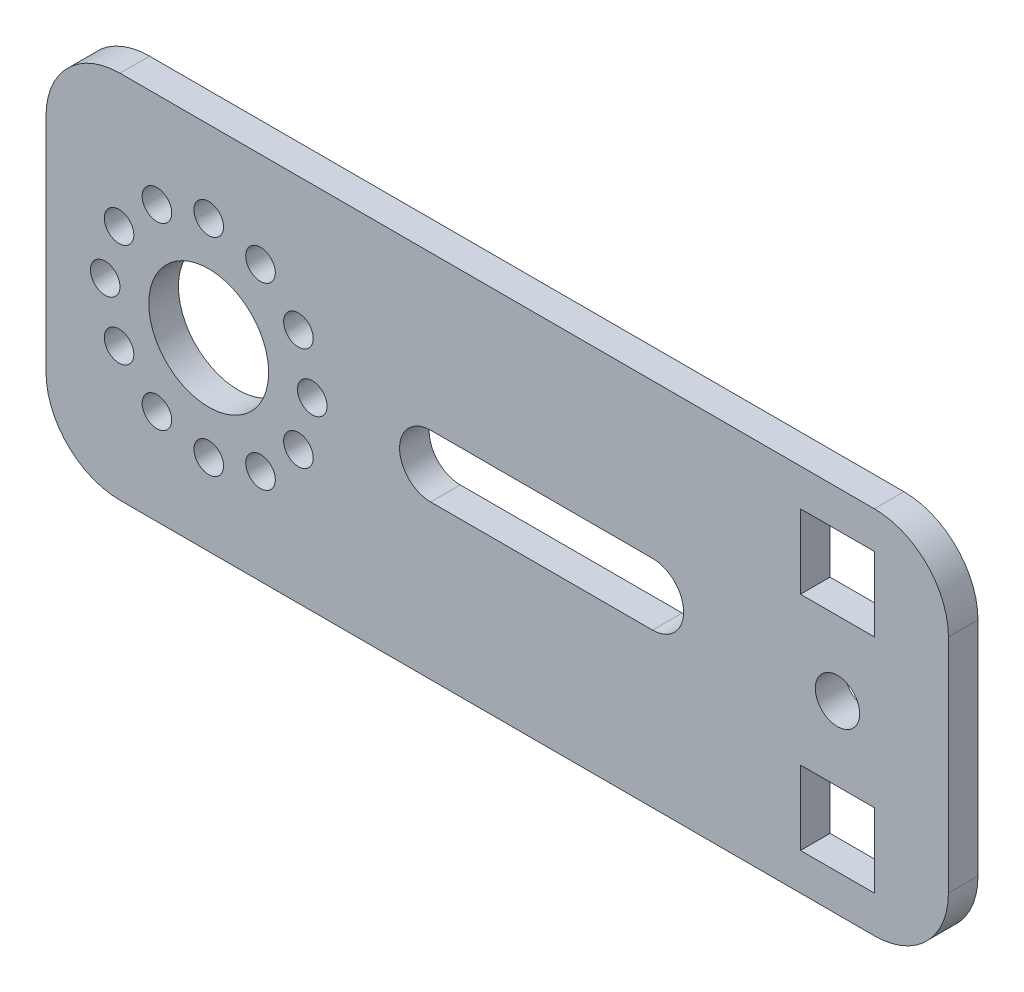
ISO-10303-21;
HEADER;
FILE_DESCRIPTION(('STEP AP214'),'2;1');
FILE_NAME('part.step','',(''),(''),'','','');
FILE_SCHEMA(('AUTOMOTIVE_DESIGN { 1 0 10303 214 1 1 1 1 }'));
ENDSEC;
DATA;
#1=APPLICATION_CONTEXT('core data for automotive mechanical design processes');
#2=APPLICATION_PROTOCOL_DEFINITION('international standard','automotive_design',2000,#1);
#3=PRODUCT_CONTEXT('',#1,'mechanical');
#4=PRODUCT('Part','Part','',(#3));
#5=PRODUCT_RELATED_PRODUCT_CATEGORY('part','',(#4));
#6=PRODUCT_DEFINITION_FORMATION('','',#4);
#7=PRODUCT_DEFINITION_CONTEXT('part definition',#1,'design');
#8=PRODUCT_DEFINITION('design','',#6,#7);
#9=PRODUCT_DEFINITION_SHAPE('','',#8);
#10=(LENGTH_UNIT() NAMED_UNIT(*) SI_UNIT(.MILLI.,.METRE.));
#11=(NAMED_UNIT(*) PLANE_ANGLE_UNIT() SI_UNIT($,.RADIAN.));
#12=(NAMED_UNIT(*) SI_UNIT($,.STERADIAN.) SOLID_ANGLE_UNIT());
#13=UNCERTAINTY_MEASURE_WITH_UNIT(LENGTH_MEASURE(1.E-05),#10,'distance_accuracy_value','');
#14=(GEOMETRIC_REPRESENTATION_CONTEXT(3) GLOBAL_UNCERTAINTY_ASSIGNED_CONTEXT((#13)) GLOBAL_UNIT_ASSIGNED_CONTEXT((#10,
#11,#12)) REPRESENTATION_CONTEXT('',''));
#15=CARTESIAN_POINT('',(0.,0.,0.));
#16=DIRECTION('',(0.,0.,1.));
#17=DIRECTION('',(1.,0.,0.));
#18=AXIS2_PLACEMENT_3D('',#15,#16,#17);
#19=CARTESIAN_POINT('',(61.,12.5,2.));
#20=DIRECTION('',(1.,0.,0.));
#21=DIRECTION('',(0.,0.,-1.));
#22=AXIS2_PLACEMENT_3D('',#19,#20,#21);
#23=PLANE('',#22);
#24=DIRECTION('',(0.,-1.,0.));
#25=VECTOR('',#24,1.);
#26=CARTESIAN_POINT('',(61.,12.5,0.));
#27=LINE('',#26,#25);
#28=CARTESIAN_POINT('',(61.,7.5,0.));
#29=VERTEX_POINT('',#28);
#30=CARTESIAN_POINT('',(61.,-7.5,0.));
#31=VERTEX_POINT('',#30);
#32=EDGE_CURVE('E420',#29,#31,#27,.T.);
#33=ORIENTED_EDGE('',*,*,#32,.F.);
#34=DIRECTION('',(0.,0.,-1.));
#35=VECTOR('',#34,1.);
#36=CARTESIAN_POINT('',(61.,7.5,2.));
#37=LINE('',#36,#35);
#38=CARTESIAN_POINT('',(61.,7.5,2.));
#39=VERTEX_POINT('',#38);
#40=EDGE_CURVE('E483',#29,#39,#37,.F.);
#41=ORIENTED_EDGE('',*,*,#40,.T.);
#42=DIRECTION('',(0.,-1.,0.));
#43=VECTOR('',#42,1.);
#44=CARTESIAN_POINT('',(61.,12.5,2.));
#45=LINE('',#44,#43);
#46=CARTESIAN_POINT('',(61.,-7.5,2.));
#47=VERTEX_POINT('',#46);
#48=EDGE_CURVE('E430',#39,#47,#45,.T.);
#49=ORIENTED_EDGE('',*,*,#48,.T.);
#50=DIRECTION('',(0.,0.,-1.));
#51=VECTOR('',#50,1.);
#52=CARTESIAN_POINT('',(61.,-7.5,2.));
#53=LINE('',#52,#51);
#54=EDGE_CURVE('E479',#47,#31,#53,.T.);
#55=ORIENTED_EDGE('',*,*,#54,.T.);
#56=EDGE_LOOP('',(#33,#41,#49,#55));
#57=FACE_BOUND('',#56,.T.);
#58=ADVANCED_FACE('F39',(#57),#23,.T.);
#59=CARTESIAN_POINT('',(0.,12.5,2.));
#60=DIRECTION('',(0.,1.,0.));
#61=DIRECTION('',(0.,0.,1.));
#62=AXIS2_PLACEMENT_3D('',#59,#60,#61);
#63=PLANE('',#62);
#64=DIRECTION('',(1.,0.,0.));
#65=VECTOR('',#64,1.);
#66=CARTESIAN_POINT('',(0.,12.5,2.));
#67=LINE('',#66,#65);
#68=CARTESIAN_POINT('',(5.,12.5,2.));
#69=VERTEX_POINT('',#68);
#70=CARTESIAN_POINT('',(56.,12.5,2.));
#71=VERTEX_POINT('',#70);
#72=EDGE_CURVE('E442',#69,#71,#67,.T.);
#73=ORIENTED_EDGE('',*,*,#72,.T.);
#74=DIRECTION('',(0.,0.,-1.));
#75=VECTOR('',#74,1.);
#76=CARTESIAN_POINT('',(56.,12.5,2.));
#77=LINE('',#76,#75);
#78=CARTESIAN_POINT('',(56.,12.5,0.));
#79=VERTEX_POINT('',#78);
#80=EDGE_CURVE('E463',#71,#79,#77,.T.);
#81=ORIENTED_EDGE('',*,*,#80,.T.);
#82=DIRECTION('',(1.,0.,0.));
#83=VECTOR('',#82,1.);
#84=CARTESIAN_POINT('',(0.,12.5,0.));
#85=LINE('',#84,#83);
#86=CARTESIAN_POINT('',(5.,12.5,0.));
#87=VERTEX_POINT('',#86);
#88=EDGE_CURVE('E435',#87,#79,#85,.T.);
#89=ORIENTED_EDGE('',*,*,#88,.F.);
#90=DIRECTION('',(0.,0.,-1.));
#91=VECTOR('',#90,1.);
#92=CARTESIAN_POINT('',(5.,12.5,2.));
#93=LINE('',#92,#91);
#94=EDGE_CURVE('E446',#87,#69,#93,.F.);
#95=ORIENTED_EDGE('',*,*,#94,.T.);
#96=EDGE_LOOP('',(#73,#81,#89,#95));
#97=FACE_BOUND('',#96,.T.);
#98=ADVANCED_FACE('F531',(#97),#63,.T.);
#99=CARTESIAN_POINT('',(0.,-12.5,2.));
#100=DIRECTION('',(-1.,0.,0.));
#101=DIRECTION('',(0.,0.,1.));
#102=AXIS2_PLACEMENT_3D('',#99,#100,#101);
#103=PLANE('',#102);
#104=DIRECTION('',(0.,1.,0.));
#105=VECTOR('',#104,1.);
#106=CARTESIAN_POINT('',(0.,-12.5,0.));
#107=LINE('',#106,#105);
#108=CARTESIAN_POINT('',(0.,-7.5,0.));
#109=VERTEX_POINT('',#108);
#110=CARTESIAN_POINT('',(0.,7.5,0.));
#111=VERTEX_POINT('',#110);
#112=EDGE_CURVE('E454',#109,#111,#107,.T.);
#113=ORIENTED_EDGE('',*,*,#112,.F.);
#114=DIRECTION('',(0.,0.,-1.));
#115=VECTOR('',#114,1.);
#116=CARTESIAN_POINT('',(0.,-7.5,2.));
#117=LINE('',#116,#115);
#118=CARTESIAN_POINT('',(0.,-7.5,2.));
#119=VERTEX_POINT('',#118);
#120=EDGE_CURVE('E11',#109,#119,#117,.F.);
#121=ORIENTED_EDGE('',*,*,#120,.T.);
#122=DIRECTION('',(0.,1.,0.));
#123=VECTOR('',#122,1.);
#124=CARTESIAN_POINT('',(0.,-12.5,2.));
#125=LINE('',#124,#123);
#126=CARTESIAN_POINT('',(0.,7.5,2.));
#127=VERTEX_POINT('',#126);
#128=EDGE_CURVE('E438',#119,#127,#125,.T.);
#129=ORIENTED_EDGE('',*,*,#128,.T.);
#130=DIRECTION('',(0.,0.,-1.));
#131=VECTOR('',#130,1.);
#132=CARTESIAN_POINT('',(0.,7.5,2.));
#133=LINE('',#132,#131);
#134=EDGE_CURVE('E48',#127,#111,#133,.T.);
#135=ORIENTED_EDGE('',*,*,#134,.T.);
#136=EDGE_LOOP('',(#113,#121,#129,#135));
#137=FACE_BOUND('',#136,.T.);
#138=ADVANCED_FACE('F507',(#137),#103,.T.);
#139=CARTESIAN_POINT('',(61.,-12.5,2.));
#140=DIRECTION('',(0.,-1.,0.));
#141=DIRECTION('',(0.,0.,-1.));
#142=AXIS2_PLACEMENT_3D('',#139,#140,#141);
#143=PLANE('',#142);
#144=DIRECTION('',(-1.,0.,0.));
#145=VECTOR('',#144,1.);
#146=CARTESIAN_POINT('',(61.,-12.5,0.));
#147=LINE('',#146,#145);
#148=CARTESIAN_POINT('',(56.,-12.5,0.));
#149=VERTEX_POINT('',#148);
#150=CARTESIAN_POINT('',(5.00000000000001,-12.5,0.));
#151=VERTEX_POINT('',#150);
#152=EDGE_CURVE('E450',#149,#151,#147,.T.);
#153=ORIENTED_EDGE('',*,*,#152,.F.);
#154=DIRECTION('',(0.,0.,-1.));
#155=VECTOR('',#154,1.);
#156=CARTESIAN_POINT('',(56.,-12.5,2.));
#157=LINE('',#156,#155);
#158=CARTESIAN_POINT('',(56.,-12.5,2.));
#159=VERTEX_POINT('',#158);
#160=EDGE_CURVE('E62',#149,#159,#157,.F.);
#161=ORIENTED_EDGE('',*,*,#160,.T.);
#162=DIRECTION('',(-1.,0.,0.));
#163=VECTOR('',#162,1.);
#164=CARTESIAN_POINT('',(61.,-12.5,2.));
#165=LINE('',#164,#163);
#166=CARTESIAN_POINT('',(5.00000000000001,-12.5,2.));
#167=VERTEX_POINT('',#166);
#168=EDGE_CURVE('E434',#159,#167,#165,.T.);
#169=ORIENTED_EDGE('',*,*,#168,.T.);
#170=DIRECTION('',(0.,0.,-1.));
#171=VECTOR('',#170,1.);
#172=CARTESIAN_POINT('',(5.,-12.5,2.));
#173=LINE('',#172,#171);
#174=EDGE_CURVE('E497',#167,#151,#173,.T.);
#175=ORIENTED_EDGE('',*,*,#174,.T.);
#176=EDGE_LOOP('',(#153,#161,#169,#175));
#177=FACE_BOUND('',#176,.T.);
#178=ADVANCED_FACE('F517',(#177),#143,.T.);
#179=CARTESIAN_POINT('',(0.,0.,2.));
#180=DIRECTION('',(0.,0.,-1.));
#181=DIRECTION('',(-1.,0.,0.));
#182=AXIS2_PLACEMENT_3D('',#179,#180,#181);
#183=PLANE('',#182);
#184=CARTESIAN_POINT('',(53.5,0.,2.));
#185=DIRECTION('',(0.,0.,-1.));
#186=DIRECTION('',(-1.,0.,0.));
#187=AXIS2_PLACEMENT_3D('',#184,#185,#186);
#188=CIRCLE('',#187,1.5);
#189=CARTESIAN_POINT('',(52.,0.,2.));
#190=VERTEX_POINT('',#189);
#191=EDGE_CURVE('E223',#190,#190,#188,.T.);
#192=ORIENTED_EDGE('',*,*,#191,.T.);
#193=EDGE_LOOP('',(#192));
#194=FACE_BOUND('',#193,.T.);
#195=DIRECTION('',(0.,-1.,0.));
#196=VECTOR('',#195,1.);
#197=CARTESIAN_POINT('',(56.,4.99999999999998,2.));
#198=LINE('',#197,#196);
#199=CARTESIAN_POINT('',(56.,9.99999999999998,2.));
#200=VERTEX_POINT('',#199);
#201=CARTESIAN_POINT('',(56.,4.99999999999998,2.));
#202=VERTEX_POINT('',#201);
#203=EDGE_CURVE('E191',#200,#202,#198,.T.);
#204=ORIENTED_EDGE('',*,*,#203,.T.);
#205=DIRECTION('',(-1.,0.,0.));
#206=VECTOR('',#205,1.);
#207=CARTESIAN_POINT('',(56.,4.99999999999998,2.));
#208=LINE('',#207,#206);
#209=CARTESIAN_POINT('',(51.,4.99999999999998,2.));
#210=VERTEX_POINT('',#209);
#211=EDGE_CURVE('E182',#202,#210,#208,.T.);
#212=ORIENTED_EDGE('',*,*,#211,.T.);
#213=DIRECTION('',(0.,1.,0.));
#214=VECTOR('',#213,1.);
#215=CARTESIAN_POINT('',(51.,4.99999999999998,2.));
#216=LINE('',#215,#214);
#217=CARTESIAN_POINT('',(51.,9.99999999999998,2.));
#218=VERTEX_POINT('',#217);
#219=EDGE_CURVE('E195',#210,#218,#216,.T.);
#220=ORIENTED_EDGE('',*,*,#219,.T.);
#221=DIRECTION('',(1.,0.,0.));
#222=VECTOR('',#221,1.);
#223=CARTESIAN_POINT('',(56.,9.99999999999998,2.));
#224=LINE('',#223,#222);
#225=EDGE_CURVE('E200',#218,#200,#224,.T.);
#226=ORIENTED_EDGE('',*,*,#225,.T.);
#227=EDGE_LOOP('',(#204,#212,#220,#226));
#228=FACE_BOUND('',#227,.T.);
#229=DIRECTION('',(0.,1.,0.));
#230=VECTOR('',#229,1.);
#231=CARTESIAN_POINT('',(51.,-5.00000000000002,2.));
#232=LINE('',#231,#230);
#233=CARTESIAN_POINT('',(51.,-10.,2.));
#234=VERTEX_POINT('',#233);
#235=CARTESIAN_POINT('',(51.,-5.00000000000002,2.));
#236=VERTEX_POINT('',#235);
#237=EDGE_CURVE('E251',#234,#236,#232,.T.);
#238=ORIENTED_EDGE('',*,*,#237,.T.);
#239=DIRECTION('',(1.,0.,0.));
#240=VECTOR('',#239,1.);
#241=CARTESIAN_POINT('',(56.,-5.00000000000002,2.));
#242=LINE('',#241,#240);
#243=CARTESIAN_POINT('',(56.,-5.00000000000002,2.));
#244=VERTEX_POINT('',#243);
#245=EDGE_CURVE('E238',#236,#244,#242,.T.);
#246=ORIENTED_EDGE('',*,*,#245,.T.);
#247=DIRECTION('',(0.,-1.,0.));
#248=VECTOR('',#247,1.);
#249=CARTESIAN_POINT('',(56.,-5.00000000000002,2.));
#250=LINE('',#249,#248);
#251=CARTESIAN_POINT('',(56.,-10.,2.));
#252=VERTEX_POINT('',#251);
#253=EDGE_CURVE('E242',#244,#252,#250,.T.);
#254=ORIENTED_EDGE('',*,*,#253,.T.);
#255=DIRECTION('',(-1.,0.,0.));
#256=VECTOR('',#255,1.);
#257=CARTESIAN_POINT('',(56.,-10.,2.));
#258=LINE('',#257,#256);
#259=EDGE_CURVE('E247',#252,#234,#258,.T.);
#260=ORIENTED_EDGE('',*,*,#259,.T.);
#261=EDGE_LOOP('',(#238,#246,#254,#260));
#262=FACE_BOUND('',#261,.T.);
#263=CARTESIAN_POINT('',(4.93782217350893,3.5,2.));
#264=DIRECTION('',(0.,0.,-1.));
#265=DIRECTION('',(-1.,0.,0.));
#266=AXIS2_PLACEMENT_3D('',#263,#264,#265);
#267=CIRCLE('',#266,1.);
#268=CARTESIAN_POINT('',(3.93782217350893,3.5,2.));
#269=VERTEX_POINT('',#268);
#270=EDGE_CURVE('E282',#269,#269,#267,.T.);
#271=ORIENTED_EDGE('',*,*,#270,.T.);
#272=EDGE_LOOP('',(#271));
#273=FACE_BOUND('',#272,.T.);
#274=CARTESIAN_POINT('',(7.5,6.06217782649107,2.));
#275=DIRECTION('',(0.,0.,-1.));
#276=DIRECTION('',(-1.,0.,0.));
#277=AXIS2_PLACEMENT_3D('',#274,#275,#276);
#278=CIRCLE('',#277,1.);
#279=CARTESIAN_POINT('',(6.5,6.06217782649107,2.));
#280=VERTEX_POINT('',#279);
#281=EDGE_CURVE('E290',#280,#280,#278,.T.);
#282=ORIENTED_EDGE('',*,*,#281,.T.);
#283=EDGE_LOOP('',(#282));
#284=FACE_BOUND('',#283,.T.);
#285=CARTESIAN_POINT('',(11.,7.,2.));
#286=DIRECTION('',(0.,0.,-1.));
#287=DIRECTION('',(-1.,0.,0.));
#288=AXIS2_PLACEMENT_3D('',#285,#286,#287);
#289=CIRCLE('',#288,1.);
#290=CARTESIAN_POINT('',(10.,7.,2.));
#291=VERTEX_POINT('',#290);
#292=EDGE_CURVE('E298',#291,#291,#289,.T.);
#293=ORIENTED_EDGE('',*,*,#292,.T.);
#294=EDGE_LOOP('',(#293));
#295=FACE_BOUND('',#294,.T.);
#296=CARTESIAN_POINT('',(14.5,6.06217782649107,2.));
#297=DIRECTION('',(0.,0.,-1.));
#298=DIRECTION('',(-1.,0.,0.));
#299=AXIS2_PLACEMENT_3D('',#296,#297,#298);
#300=CIRCLE('',#299,1.);
#301=CARTESIAN_POINT('',(13.5,6.06217782649107,2.));
#302=VERTEX_POINT('',#301);
#303=EDGE_CURVE('E306',#302,#302,#300,.T.);
#304=ORIENTED_EDGE('',*,*,#303,.T.);
#305=EDGE_LOOP('',(#304));
#306=FACE_BOUND('',#305,.T.);
#307=CARTESIAN_POINT('',(17.0621778264911,3.5,2.));
#308=DIRECTION('',(0.,0.,-1.));
#309=DIRECTION('',(-1.,0.,0.));
#310=AXIS2_PLACEMENT_3D('',#307,#308,#309);
#311=CIRCLE('',#310,1.);
#312=CARTESIAN_POINT('',(16.0621778264911,3.5,2.));
#313=VERTEX_POINT('',#312);
#314=EDGE_CURVE('E314',#313,#313,#311,.T.);
#315=ORIENTED_EDGE('',*,*,#314,.T.);
#316=EDGE_LOOP('',(#315));
#317=FACE_BOUND('',#316,.T.);
#318=CARTESIAN_POINT('',(18.,0.,2.));
#319=DIRECTION('',(0.,0.,-1.));
#320=DIRECTION('',(-1.,0.,0.));
#321=AXIS2_PLACEMENT_3D('',#318,#319,#320);
#322=CIRCLE('',#321,0.999999999999998);
#323=CARTESIAN_POINT('',(17.,0.,2.));
#324=VERTEX_POINT('',#323);
#325=EDGE_CURVE('E322',#324,#324,#322,.T.);
#326=ORIENTED_EDGE('',*,*,#325,.T.);
#327=EDGE_LOOP('',(#326));
#328=FACE_BOUND('',#327,.T.);
#329=CARTESIAN_POINT('',(17.0621778264911,-3.5,2.));
#330=DIRECTION('',(0.,0.,-1.));
#331=DIRECTION('',(-1.,0.,0.));
#332=AXIS2_PLACEMENT_3D('',#329,#330,#331);
#333=CIRCLE('',#332,0.999999999999998);
#334=CARTESIAN_POINT('',(16.0621778264911,-3.5,2.));
#335=VERTEX_POINT('',#334);
#336=EDGE_CURVE('E330',#335,#335,#333,.T.);
#337=ORIENTED_EDGE('',*,*,#336,.T.);
#338=EDGE_LOOP('',(#337));
#339=FACE_BOUND('',#338,.T.);
#340=CARTESIAN_POINT('',(14.5,-6.06217782649107,2.));
#341=DIRECTION('',(0.,0.,-1.));
#342=DIRECTION('',(-1.,0.,0.));
#343=AXIS2_PLACEMENT_3D('',#340,#341,#342);
#344=CIRCLE('',#343,1.);
#345=CARTESIAN_POINT('',(13.5,-6.06217782649107,2.));
#346=VERTEX_POINT('',#345);
#347=EDGE_CURVE('E338',#346,#346,#344,.T.);
#348=ORIENTED_EDGE('',*,*,#347,.T.);
#349=EDGE_LOOP('',(#348));
#350=FACE_BOUND('',#349,.T.);
#351=CARTESIAN_POINT('',(11.,-7.,2.));
#352=DIRECTION('',(0.,0.,-1.));
#353=DIRECTION('',(-1.,0.,0.));
#354=AXIS2_PLACEMENT_3D('',#351,#352,#353);
#355=CIRCLE('',#354,1.);
#356=CARTESIAN_POINT('',(10.,-7.,2.));
#357=VERTEX_POINT('',#356);
#358=EDGE_CURVE('E346',#357,#357,#355,.T.);
#359=ORIENTED_EDGE('',*,*,#358,.T.);
#360=EDGE_LOOP('',(#359));
#361=FACE_BOUND('',#360,.T.);
#362=CARTESIAN_POINT('',(7.5,-6.06217782649107,2.));
#363=DIRECTION('',(0.,0.,-1.));
#364=DIRECTION('',(-1.,0.,0.));
#365=AXIS2_PLACEMENT_3D('',#362,#363,#364);
#366=CIRCLE('',#365,1.);
#367=CARTESIAN_POINT('',(6.5,-6.06217782649107,2.));
#368=VERTEX_POINT('',#367);
#369=EDGE_CURVE('E354',#368,#368,#366,.T.);
#370=ORIENTED_EDGE('',*,*,#369,.T.);
#371=EDGE_LOOP('',(#370));
#372=FACE_BOUND('',#371,.T.);
#373=CARTESIAN_POINT('',(4.93782217350893,-3.5,2.));
#374=DIRECTION('',(0.,0.,-1.));
#375=DIRECTION('',(-1.,0.,0.));
#376=AXIS2_PLACEMENT_3D('',#373,#374,#375);
#377=CIRCLE('',#376,1.);
#378=CARTESIAN_POINT('',(3.93782217350893,-3.5,2.));
#379=VERTEX_POINT('',#378);
#380=EDGE_CURVE('E362',#379,#379,#377,.T.);
#381=ORIENTED_EDGE('',*,*,#380,.T.);
#382=EDGE_LOOP('',(#381));
#383=FACE_BOUND('',#382,.T.);
#384=CARTESIAN_POINT('',(4.,0.,2.));
#385=DIRECTION('',(0.,0.,-1.));
#386=DIRECTION('',(-1.,0.,0.));
#387=AXIS2_PLACEMENT_3D('',#384,#385,#386);
#388=CIRCLE('',#387,1.);
#389=CARTESIAN_POINT('',(3.,0.,2.));
#390=VERTEX_POINT('',#389);
#391=EDGE_CURVE('E370',#390,#390,#388,.T.);
#392=ORIENTED_EDGE('',*,*,#391,.T.);
#393=EDGE_LOOP('',(#392));
#394=FACE_BOUND('',#393,.T.);
#395=CARTESIAN_POINT('',(11.,0.,2.));
#396=DIRECTION('',(0.,0.,-1.));
#397=DIRECTION('',(-1.,0.,0.));
#398=AXIS2_PLACEMENT_3D('',#395,#396,#397);
#399=CIRCLE('',#398,4.05);
#400=CARTESIAN_POINT('',(6.95,0.,2.));
#401=VERTEX_POINT('',#400);
#402=EDGE_CURVE('E378',#401,#401,#399,.T.);
#403=ORIENTED_EDGE('',*,*,#402,.T.);
#404=EDGE_LOOP('',(#403));
#405=FACE_BOUND('',#404,.T.);
#406=DIRECTION('',(-1.,0.,0.));
#407=VECTOR('',#406,1.);
#408=CARTESIAN_POINT('',(26.,-2.1,2.));
#409=LINE('',#408,#407);
#410=CARTESIAN_POINT('',(41.,-2.1,2.));
#411=VERTEX_POINT('',#410);
#412=CARTESIAN_POINT('',(26.,-2.1,2.));
#413=VERTEX_POINT('',#412);
#414=EDGE_CURVE('E399',#411,#413,#409,.T.);
#415=ORIENTED_EDGE('',*,*,#414,.T.);
#416=CARTESIAN_POINT('',(26.,0.,2.));
#417=DIRECTION('',(0.,0.,-1.));
#418=DIRECTION('',(-1.,0.,0.));
#419=AXIS2_PLACEMENT_3D('',#416,#417,#418);
#420=CIRCLE('',#419,2.1);
#421=CARTESIAN_POINT('',(26.,2.1,2.));
#422=VERTEX_POINT('',#421);
#423=EDGE_CURVE('E386',#413,#422,#420,.T.);
#424=ORIENTED_EDGE('',*,*,#423,.T.);
#425=DIRECTION('',(1.,0.,0.));
#426=VECTOR('',#425,1.);
#427=CARTESIAN_POINT('',(26.,2.1,2.));
#428=LINE('',#427,#426);
#429=CARTESIAN_POINT('',(41.,2.1,2.));
#430=VERTEX_POINT('',#429);
#431=EDGE_CURVE('E390',#422,#430,#428,.T.);
#432=ORIENTED_EDGE('',*,*,#431,.T.);
#433=CARTESIAN_POINT('',(41.,0.,2.));
#434=DIRECTION('',(0.,0.,-1.));
#435=DIRECTION('',(-1.,0.,0.));
#436=AXIS2_PLACEMENT_3D('',#433,#434,#435);
#437=CIRCLE('',#436,2.1);
#438=EDGE_CURVE('E395',#430,#411,#437,.T.);
#439=ORIENTED_EDGE('',*,*,#438,.T.);
#440=EDGE_LOOP('',(#415,#424,#432,#439));
#441=FACE_BOUND('',#440,.T.);
#442=ORIENTED_EDGE('',*,*,#48,.F.);
#443=CARTESIAN_POINT('',(56.,7.5,2.));
#444=DIRECTION('',(0.,0.,-1.));
#445=DIRECTION('',(-1.,0.,0.));
#446=AXIS2_PLACEMENT_3D('',#443,#444,#445);
#447=CIRCLE('',#446,5.);
#448=EDGE_CURVE('E494',#39,#71,#447,.F.);
#449=ORIENTED_EDGE('',*,*,#448,.T.);
#450=ORIENTED_EDGE('',*,*,#72,.F.);
#451=CARTESIAN_POINT('',(5.,7.5,2.));
#452=DIRECTION('',(0.,0.,-1.));
#453=DIRECTION('',(-1.,0.,0.));
#454=AXIS2_PLACEMENT_3D('',#451,#452,#453);
#455=CIRCLE('',#454,5.);
#456=EDGE_CURVE('E486',#69,#127,#455,.F.);
#457=ORIENTED_EDGE('',*,*,#456,.T.);
#458=ORIENTED_EDGE('',*,*,#128,.F.);
#459=CARTESIAN_POINT('',(5.,-7.5,2.));
#460=DIRECTION('',(0.,0.,-1.));
#461=DIRECTION('',(-1.,0.,0.));
#462=AXIS2_PLACEMENT_3D('',#459,#460,#461);
#463=CIRCLE('',#462,5.);
#464=EDGE_CURVE('E55',#119,#167,#463,.F.);
#465=ORIENTED_EDGE('',*,*,#464,.T.);
#466=ORIENTED_EDGE('',*,*,#168,.F.);
#467=CARTESIAN_POINT('',(56.,-7.5,2.));
#468=DIRECTION('',(0.,0.,-1.));
#469=DIRECTION('',(-1.,0.,0.));
#470=AXIS2_PLACEMENT_3D('',#467,#468,#469);
#471=CIRCLE('',#470,5.);
#472=EDGE_CURVE('E491',#159,#47,#471,.F.);
#473=ORIENTED_EDGE('',*,*,#472,.T.);
#474=EDGE_LOOP('',(#442,#449,#450,#457,#458,#465,#466,#473));
#475=FACE_BOUND('',#474,.T.);
#476=ADVANCED_FACE('F202',(#194,#228,#262,#273,#284,#295,#306,#317,#328,#339,#350,#361,#372,
#383,#394,#405,#441,#475),#183,.F.);
#477=CARTESIAN_POINT('',(0.,0.,0.));
#478=DIRECTION('',(0.,0.,-1.));
#479=DIRECTION('',(-1.,0.,0.));
#480=AXIS2_PLACEMENT_3D('',#477,#478,#479);
#481=PLANE('',#480);
#482=CARTESIAN_POINT('',(53.5,0.,0.));
#483=DIRECTION('',(0.,0.,-1.));
#484=DIRECTION('',(-1.,0.,0.));
#485=AXIS2_PLACEMENT_3D('',#482,#483,#484);
#486=CIRCLE('',#485,1.5);
#487=CARTESIAN_POINT('',(52.,0.,0.));
#488=VERTEX_POINT('',#487);
#489=EDGE_CURVE('E213',#488,#488,#486,.T.);
#490=ORIENTED_EDGE('',*,*,#489,.F.);
#491=EDGE_LOOP('',(#490));
#492=FACE_BOUND('',#491,.T.);
#493=DIRECTION('',(-1.,0.,0.));
#494=VECTOR('',#493,1.);
#495=CARTESIAN_POINT('',(56.,4.99999999999998,0.));
#496=LINE('',#495,#494);
#497=CARTESIAN_POINT('',(56.,4.99999999999998,0.));
#498=VERTEX_POINT('',#497);
#499=CARTESIAN_POINT('',(51.,4.99999999999998,0.));
#500=VERTEX_POINT('',#499);
#501=EDGE_CURVE('E185',#498,#500,#496,.T.);
#502=ORIENTED_EDGE('',*,*,#501,.F.);
#503=DIRECTION('',(0.,-1.,0.));
#504=VECTOR('',#503,1.);
#505=CARTESIAN_POINT('',(56.,4.99999999999998,0.));
#506=LINE('',#505,#504);
#507=CARTESIAN_POINT('',(56.,9.99999999999998,0.));
#508=VERTEX_POINT('',#507);
#509=EDGE_CURVE('E206',#508,#498,#506,.T.);
#510=ORIENTED_EDGE('',*,*,#509,.F.);
#511=DIRECTION('',(1.,0.,0.));
#512=VECTOR('',#511,1.);
#513=CARTESIAN_POINT('',(56.,9.99999999999998,0.));
#514=LINE('',#513,#512);
#515=CARTESIAN_POINT('',(51.,9.99999999999998,0.));
#516=VERTEX_POINT('',#515);
#517=EDGE_CURVE('E210',#516,#508,#514,.T.);
#518=ORIENTED_EDGE('',*,*,#517,.F.);
#519=DIRECTION('',(0.,1.,0.));
#520=VECTOR('',#519,1.);
#521=CARTESIAN_POINT('',(51.,4.99999999999998,0.));
#522=LINE('',#521,#520);
#523=EDGE_CURVE('E222',#500,#516,#522,.T.);
#524=ORIENTED_EDGE('',*,*,#523,.F.);
#525=EDGE_LOOP('',(#502,#510,#518,#524));
#526=FACE_BOUND('',#525,.T.);
#527=DIRECTION('',(1.,0.,0.));
#528=VECTOR('',#527,1.);
#529=CARTESIAN_POINT('',(56.,-5.00000000000002,0.));
#530=LINE('',#529,#528);
#531=CARTESIAN_POINT('',(51.,-5.00000000000002,0.));
#532=VERTEX_POINT('',#531);
#533=CARTESIAN_POINT('',(56.,-5.00000000000002,0.));
#534=VERTEX_POINT('',#533);
#535=EDGE_CURVE('E232',#532,#534,#530,.T.);
#536=ORIENTED_EDGE('',*,*,#535,.F.);
#537=DIRECTION('',(0.,1.,0.));
#538=VECTOR('',#537,1.);
#539=CARTESIAN_POINT('',(51.,-5.00000000000002,0.));
#540=LINE('',#539,#538);
#541=CARTESIAN_POINT('',(51.,-10.,0.));
#542=VERTEX_POINT('',#541);
#543=EDGE_CURVE('E243',#542,#532,#540,.T.);
#544=ORIENTED_EDGE('',*,*,#543,.F.);
#545=DIRECTION('',(-1.,0.,0.));
#546=VECTOR('',#545,1.);
#547=CARTESIAN_POINT('',(56.,-10.,0.));
#548=LINE('',#547,#546);
#549=CARTESIAN_POINT('',(56.,-10.,0.));
#550=VERTEX_POINT('',#549);
#551=EDGE_CURVE('E262',#550,#542,#548,.T.);
#552=ORIENTED_EDGE('',*,*,#551,.F.);
#553=DIRECTION('',(0.,-1.,0.));
#554=VECTOR('',#553,1.);
#555=CARTESIAN_POINT('',(56.,-5.00000000000002,0.));
#556=LINE('',#555,#554);
#557=EDGE_CURVE('E258',#534,#550,#556,.T.);
#558=ORIENTED_EDGE('',*,*,#557,.F.);
#559=EDGE_LOOP('',(#536,#544,#552,#558));
#560=FACE_BOUND('',#559,.T.);
#561=CARTESIAN_POINT('',(4.93782217350893,3.5,0.));
#562=DIRECTION('',(0.,0.,-1.));
#563=DIRECTION('',(-1.,0.,0.));
#564=AXIS2_PLACEMENT_3D('',#561,#562,#563);
#565=CIRCLE('',#564,1.);
#566=CARTESIAN_POINT('',(3.93782217350893,3.5,0.));
#567=VERTEX_POINT('',#566);
#568=EDGE_CURVE('E272',#567,#567,#565,.T.);
#569=ORIENTED_EDGE('',*,*,#568,.F.);
#570=EDGE_LOOP('',(#569));
#571=FACE_BOUND('',#570,.T.);
#572=CARTESIAN_POINT('',(7.5,6.06217782649107,0.));
#573=DIRECTION('',(0.,0.,-1.));
#574=DIRECTION('',(-1.,0.,0.));
#575=AXIS2_PLACEMENT_3D('',#572,#573,#574);
#576=CIRCLE('',#575,1.);
#577=CARTESIAN_POINT('',(6.5,6.06217782649107,0.));
#578=VERTEX_POINT('',#577);
#579=EDGE_CURVE('E286',#578,#578,#576,.T.);
#580=ORIENTED_EDGE('',*,*,#579,.F.);
#581=EDGE_LOOP('',(#580));
#582=FACE_BOUND('',#581,.T.);
#583=CARTESIAN_POINT('',(11.,7.,0.));
#584=DIRECTION('',(0.,0.,-1.));
#585=DIRECTION('',(-1.,0.,0.));
#586=AXIS2_PLACEMENT_3D('',#583,#584,#585);
#587=CIRCLE('',#586,1.);
#588=CARTESIAN_POINT('',(10.,7.,0.));
#589=VERTEX_POINT('',#588);
#590=EDGE_CURVE('E294',#589,#589,#587,.T.);
#591=ORIENTED_EDGE('',*,*,#590,.F.);
#592=EDGE_LOOP('',(#591));
#593=FACE_BOUND('',#592,.T.);
#594=CARTESIAN_POINT('',(14.5,6.06217782649107,0.));
#595=DIRECTION('',(0.,0.,-1.));
#596=DIRECTION('',(-1.,0.,0.));
#597=AXIS2_PLACEMENT_3D('',#594,#595,#596);
#598=CIRCLE('',#597,1.);
#599=CARTESIAN_POINT('',(13.5,6.06217782649107,0.));
#600=VERTEX_POINT('',#599);
#601=EDGE_CURVE('E302',#600,#600,#598,.T.);
#602=ORIENTED_EDGE('',*,*,#601,.F.);
#603=EDGE_LOOP('',(#602));
#604=FACE_BOUND('',#603,.T.);
#605=CARTESIAN_POINT('',(17.0621778264911,3.5,0.));
#606=DIRECTION('',(0.,0.,-1.));
#607=DIRECTION('',(-1.,0.,0.));
#608=AXIS2_PLACEMENT_3D('',#605,#606,#607);
#609=CIRCLE('',#608,1.);
#610=CARTESIAN_POINT('',(16.0621778264911,3.5,0.));
#611=VERTEX_POINT('',#610);
#612=EDGE_CURVE('E310',#611,#611,#609,.T.);
#613=ORIENTED_EDGE('',*,*,#612,.F.);
#614=EDGE_LOOP('',(#613));
#615=FACE_BOUND('',#614,.T.);
#616=CARTESIAN_POINT('',(18.,0.,0.));
#617=DIRECTION('',(0.,0.,-1.));
#618=DIRECTION('',(-1.,0.,0.));
#619=AXIS2_PLACEMENT_3D('',#616,#617,#618);
#620=CIRCLE('',#619,0.999999999999998);
#621=CARTESIAN_POINT('',(17.,0.,0.));
#622=VERTEX_POINT('',#621);
#623=EDGE_CURVE('E318',#622,#622,#620,.T.);
#624=ORIENTED_EDGE('',*,*,#623,.F.);
#625=EDGE_LOOP('',(#624));
#626=FACE_BOUND('',#625,.T.);
#627=CARTESIAN_POINT('',(17.0621778264911,-3.5,0.));
#628=DIRECTION('',(0.,0.,-1.));
#629=DIRECTION('',(-1.,0.,0.));
#630=AXIS2_PLACEMENT_3D('',#627,#628,#629);
#631=CIRCLE('',#630,0.999999999999998);
#632=CARTESIAN_POINT('',(16.0621778264911,-3.5,0.));
#633=VERTEX_POINT('',#632);
#634=EDGE_CURVE('E326',#633,#633,#631,.T.);
#635=ORIENTED_EDGE('',*,*,#634,.F.);
#636=EDGE_LOOP('',(#635));
#637=FACE_BOUND('',#636,.T.);
#638=CARTESIAN_POINT('',(14.5,-6.06217782649107,0.));
#639=DIRECTION('',(0.,0.,-1.));
#640=DIRECTION('',(-1.,0.,0.));
#641=AXIS2_PLACEMENT_3D('',#638,#639,#640);
#642=CIRCLE('',#641,1.);
#643=CARTESIAN_POINT('',(13.5,-6.06217782649107,0.));
#644=VERTEX_POINT('',#643);
#645=EDGE_CURVE('E334',#644,#644,#642,.T.);
#646=ORIENTED_EDGE('',*,*,#645,.F.);
#647=EDGE_LOOP('',(#646));
#648=FACE_BOUND('',#647,.T.);
#649=CARTESIAN_POINT('',(11.,-7.,0.));
#650=DIRECTION('',(0.,0.,-1.));
#651=DIRECTION('',(-1.,0.,0.));
#652=AXIS2_PLACEMENT_3D('',#649,#650,#651);
#653=CIRCLE('',#652,1.);
#654=CARTESIAN_POINT('',(10.,-7.,0.));
#655=VERTEX_POINT('',#654);
#656=EDGE_CURVE('E342',#655,#655,#653,.T.);
#657=ORIENTED_EDGE('',*,*,#656,.F.);
#658=EDGE_LOOP('',(#657));
#659=FACE_BOUND('',#658,.T.);
#660=CARTESIAN_POINT('',(7.5,-6.06217782649107,0.));
#661=DIRECTION('',(0.,0.,-1.));
#662=DIRECTION('',(-1.,0.,0.));
#663=AXIS2_PLACEMENT_3D('',#660,#661,#662);
#664=CIRCLE('',#663,1.);
#665=CARTESIAN_POINT('',(6.5,-6.06217782649107,0.));
#666=VERTEX_POINT('',#665);
#667=EDGE_CURVE('E350',#666,#666,#664,.T.);
#668=ORIENTED_EDGE('',*,*,#667,.F.);
#669=EDGE_LOOP('',(#668));
#670=FACE_BOUND('',#669,.T.);
#671=CARTESIAN_POINT('',(4.93782217350893,-3.5,0.));
#672=DIRECTION('',(0.,0.,-1.));
#673=DIRECTION('',(-1.,0.,0.));
#674=AXIS2_PLACEMENT_3D('',#671,#672,#673);
#675=CIRCLE('',#674,1.);
#676=CARTESIAN_POINT('',(3.93782217350893,-3.5,0.));
#677=VERTEX_POINT('',#676);
#678=EDGE_CURVE('E358',#677,#677,#675,.T.);
#679=ORIENTED_EDGE('',*,*,#678,.F.);
#680=EDGE_LOOP('',(#679));
#681=FACE_BOUND('',#680,.T.);
#682=CARTESIAN_POINT('',(4.,0.,0.));
#683=DIRECTION('',(0.,0.,-1.));
#684=DIRECTION('',(-1.,0.,0.));
#685=AXIS2_PLACEMENT_3D('',#682,#683,#684);
#686=CIRCLE('',#685,1.);
#687=CARTESIAN_POINT('',(3.,0.,0.));
#688=VERTEX_POINT('',#687);
#689=EDGE_CURVE('E366',#688,#688,#686,.T.);
#690=ORIENTED_EDGE('',*,*,#689,.F.);
#691=EDGE_LOOP('',(#690));
#692=FACE_BOUND('',#691,.T.);
#693=CARTESIAN_POINT('',(11.,0.,0.));
#694=DIRECTION('',(0.,0.,-1.));
#695=DIRECTION('',(-1.,0.,0.));
#696=AXIS2_PLACEMENT_3D('',#693,#694,#695);
#697=CIRCLE('',#696,4.05);
#698=CARTESIAN_POINT('',(6.95,0.,0.));
#699=VERTEX_POINT('',#698);
#700=EDGE_CURVE('E374',#699,#699,#697,.T.);
#701=ORIENTED_EDGE('',*,*,#700,.F.);
#702=EDGE_LOOP('',(#701));
#703=FACE_BOUND('',#702,.T.);
#704=CARTESIAN_POINT('',(26.,0.,0.));
#705=DIRECTION('',(0.,0.,-1.));
#706=DIRECTION('',(-1.,0.,0.));
#707=AXIS2_PLACEMENT_3D('',#704,#705,#706);
#708=CIRCLE('',#707,2.1);
#709=CARTESIAN_POINT('',(26.,-2.1,0.));
#710=VERTEX_POINT('',#709);
#711=CARTESIAN_POINT('',(26.,2.1,0.));
#712=VERTEX_POINT('',#711);
#713=EDGE_CURVE('E382',#710,#712,#708,.T.);
#714=ORIENTED_EDGE('',*,*,#713,.F.);
#715=DIRECTION('',(-1.,0.,0.));
#716=VECTOR('',#715,1.);
#717=CARTESIAN_POINT('',(26.,-2.1,0.));
#718=LINE('',#717,#716);
#719=CARTESIAN_POINT('',(41.,-2.1,0.));
#720=VERTEX_POINT('',#719);
#721=EDGE_CURVE('E391',#720,#710,#718,.T.);
#722=ORIENTED_EDGE('',*,*,#721,.F.);
#723=CARTESIAN_POINT('',(41.,0.,0.));
#724=DIRECTION('',(0.,0.,-1.));
#725=DIRECTION('',(-1.,0.,0.));
#726=AXIS2_PLACEMENT_3D('',#723,#724,#725);
#727=CIRCLE('',#726,2.1);
#728=CARTESIAN_POINT('',(41.,2.1,0.));
#729=VERTEX_POINT('',#728);
#730=EDGE_CURVE('E410',#729,#720,#727,.T.);
#731=ORIENTED_EDGE('',*,*,#730,.F.);
#732=DIRECTION('',(1.,0.,0.));
#733=VECTOR('',#732,1.);
#734=CARTESIAN_POINT('',(26.,2.1,0.));
#735=LINE('',#734,#733);
#736=EDGE_CURVE('E406',#712,#729,#735,.T.);
#737=ORIENTED_EDGE('',*,*,#736,.F.);
#738=EDGE_LOOP('',(#714,#722,#731,#737));
#739=FACE_BOUND('',#738,.T.);
#740=ORIENTED_EDGE('',*,*,#88,.T.);
#741=CARTESIAN_POINT('',(56.,7.5,0.));
#742=DIRECTION('',(0.,0.,-1.));
#743=DIRECTION('',(-1.,0.,0.));
#744=AXIS2_PLACEMENT_3D('',#741,#742,#743);
#745=CIRCLE('',#744,5.);
#746=EDGE_CURVE('E476',#79,#29,#745,.T.);
#747=ORIENTED_EDGE('',*,*,#746,.T.);
#748=ORIENTED_EDGE('',*,*,#32,.T.);
#749=CARTESIAN_POINT('',(56.,-7.5,0.));
#750=DIRECTION('',(0.,0.,-1.));
#751=DIRECTION('',(-1.,0.,0.));
#752=AXIS2_PLACEMENT_3D('',#749,#750,#751);
#753=CIRCLE('',#752,5.);
#754=EDGE_CURVE('E473',#31,#149,#753,.T.);
#755=ORIENTED_EDGE('',*,*,#754,.T.);
#756=ORIENTED_EDGE('',*,*,#152,.T.);
#757=CARTESIAN_POINT('',(5.,-7.5,0.));
#758=DIRECTION('',(0.,0.,-1.));
#759=DIRECTION('',(-1.,0.,0.));
#760=AXIS2_PLACEMENT_3D('',#757,#758,#759);
#761=CIRCLE('',#760,5.);
#762=EDGE_CURVE('E470',#151,#109,#761,.T.);
#763=ORIENTED_EDGE('',*,*,#762,.T.);
#764=ORIENTED_EDGE('',*,*,#112,.T.);
#765=CARTESIAN_POINT('',(5.,7.5,0.));
#766=DIRECTION('',(0.,0.,-1.));
#767=DIRECTION('',(-1.,0.,0.));
#768=AXIS2_PLACEMENT_3D('',#765,#766,#767);
#769=CIRCLE('',#768,5.);
#770=EDGE_CURVE('E467',#111,#87,#769,.T.);
#771=ORIENTED_EDGE('',*,*,#770,.T.);
#772=EDGE_LOOP('',(#740,#747,#748,#755,#756,#763,#764,#771));
#773=FACE_BOUND('',#772,.T.);
#774=ADVANCED_FACE('F512',(#492,#526,#560,#571,#582,#593,#604,#615,#626,#637,#648,#659,#670,
#681,#692,#703,#739,#773),#481,.T.);
#775=CARTESIAN_POINT('',(26.,0.,2.));
#776=DIRECTION('',(0.,0.,-1.));
#777=DIRECTION('',(-1.,0.,0.));
#778=AXIS2_PLACEMENT_3D('',#775,#776,#777);
#779=CYLINDRICAL_SURFACE('',#778,2.1);
#780=ORIENTED_EDGE('',*,*,#713,.T.);
#781=DIRECTION('',(0.,0.,-1.));
#782=VECTOR('',#781,1.);
#783=CARTESIAN_POINT('',(26.,2.1,2.));
#784=LINE('',#783,#782);
#785=EDGE_CURVE('E403',#422,#712,#784,.T.);
#786=ORIENTED_EDGE('',*,*,#785,.F.);
#787=ORIENTED_EDGE('',*,*,#423,.F.);
#788=DIRECTION('',(0.,0.,-1.));
#789=VECTOR('',#788,1.);
#790=CARTESIAN_POINT('',(26.,-2.1,2.));
#791=LINE('',#790,#789);
#792=EDGE_CURVE('E417',#413,#710,#791,.T.);
#793=ORIENTED_EDGE('',*,*,#792,.T.);
#794=EDGE_LOOP('',(#780,#786,#787,#793));
#795=FACE_BOUND('',#794,.T.);
#796=ADVANCED_FACE('F792',(#795),#779,.F.);
#797=CARTESIAN_POINT('',(26.,-2.1,2.));
#798=DIRECTION('',(0.,-1.,0.));
#799=DIRECTION('',(1.,0.,0.));
#800=AXIS2_PLACEMENT_3D('',#797,#798,#799);
#801=PLANE('',#800);
#802=ORIENTED_EDGE('',*,*,#721,.T.);
#803=ORIENTED_EDGE('',*,*,#792,.F.);
#804=ORIENTED_EDGE('',*,*,#414,.F.);
#805=DIRECTION('',(0.,0.,-1.));
#806=VECTOR('',#805,1.);
#807=CARTESIAN_POINT('',(41.,-2.1,2.));
#808=LINE('',#807,#806);
#809=EDGE_CURVE('E421',#411,#720,#808,.T.);
#810=ORIENTED_EDGE('',*,*,#809,.T.);
#811=EDGE_LOOP('',(#802,#803,#804,#810));
#812=FACE_BOUND('',#811,.T.);
#813=ADVANCED_FACE('F783',(#812),#801,.F.);
#814=CARTESIAN_POINT('',(41.,0.,2.));
#815=DIRECTION('',(0.,0.,-1.));
#816=DIRECTION('',(-1.,0.,0.));
#817=AXIS2_PLACEMENT_3D('',#814,#815,#816);
#818=CYLINDRICAL_SURFACE('',#817,2.1);
#819=ORIENTED_EDGE('',*,*,#730,.T.);
#820=ORIENTED_EDGE('',*,*,#809,.F.);
#821=ORIENTED_EDGE('',*,*,#438,.F.);
#822=DIRECTION('',(0.,0.,-1.));
#823=VECTOR('',#822,1.);
#824=CARTESIAN_POINT('',(41.,2.1,2.));
#825=LINE('',#824,#823);
#826=EDGE_CURVE('E424',#430,#729,#825,.T.);
#827=ORIENTED_EDGE('',*,*,#826,.T.);
#828=EDGE_LOOP('',(#819,#820,#821,#827));
#829=FACE_BOUND('',#828,.T.);
#830=ADVANCED_FACE('F774',(#829),#818,.F.);
#831=CARTESIAN_POINT('',(26.,2.1,2.));
#832=DIRECTION('',(0.,1.,0.));
#833=DIRECTION('',(-1.,0.,0.));
#834=AXIS2_PLACEMENT_3D('',#831,#832,#833);
#835=PLANE('',#834);
#836=ORIENTED_EDGE('',*,*,#736,.T.);
#837=ORIENTED_EDGE('',*,*,#826,.F.);
#838=ORIENTED_EDGE('',*,*,#431,.F.);
#839=ORIENTED_EDGE('',*,*,#785,.T.);
#840=EDGE_LOOP('',(#836,#837,#838,#839));
#841=FACE_BOUND('',#840,.T.);
#842=ADVANCED_FACE('F765',(#841),#835,.F.);
#843=CARTESIAN_POINT('',(11.,0.,2.));
#844=DIRECTION('',(0.,0.,-1.));
#845=DIRECTION('',(-1.,0.,0.));
#846=AXIS2_PLACEMENT_3D('',#843,#844,#845);
#847=CYLINDRICAL_SURFACE('',#846,4.05);
#848=ORIENTED_EDGE('',*,*,#402,.F.);
#849=EDGE_LOOP('',(#848));
#850=FACE_BOUND('',#849,.T.);
#851=ORIENTED_EDGE('',*,*,#700,.T.);
#852=EDGE_LOOP('',(#851));
#853=FACE_BOUND('',#852,.T.);
#854=ADVANCED_FACE('F756',(#850,#853),#847,.F.);
#855=CARTESIAN_POINT('',(4.,0.,2.));
#856=DIRECTION('',(0.,0.,-1.));
#857=DIRECTION('',(-1.,0.,0.));
#858=AXIS2_PLACEMENT_3D('',#855,#856,#857);
#859=CYLINDRICAL_SURFACE('',#858,1.);
#860=ORIENTED_EDGE('',*,*,#391,.F.);
#861=EDGE_LOOP('',(#860));
#862=FACE_BOUND('',#861,.T.);
#863=ORIENTED_EDGE('',*,*,#689,.T.);
#864=EDGE_LOOP('',(#863));
#865=FACE_BOUND('',#864,.T.);
#866=ADVANCED_FACE('F747',(#862,#865),#859,.F.);
#867=CARTESIAN_POINT('',(4.93782217350893,-3.5,2.));
#868=DIRECTION('',(0.,0.,-1.));
#869=DIRECTION('',(-1.,0.,0.));
#870=AXIS2_PLACEMENT_3D('',#867,#868,#869);
#871=CYLINDRICAL_SURFACE('',#870,1.);
#872=ORIENTED_EDGE('',*,*,#380,.F.);
#873=EDGE_LOOP('',(#872));
#874=FACE_BOUND('',#873,.T.);
#875=ORIENTED_EDGE('',*,*,#678,.T.);
#876=EDGE_LOOP('',(#875));
#877=FACE_BOUND('',#876,.T.);
#878=ADVANCED_FACE('F738',(#874,#877),#871,.F.);
#879=CARTESIAN_POINT('',(7.5,-6.06217782649107,2.));
#880=DIRECTION('',(0.,0.,-1.));
#881=DIRECTION('',(-1.,0.,0.));
#882=AXIS2_PLACEMENT_3D('',#879,#880,#881);
#883=CYLINDRICAL_SURFACE('',#882,1.);
#884=ORIENTED_EDGE('',*,*,#369,.F.);
#885=EDGE_LOOP('',(#884));
#886=FACE_BOUND('',#885,.T.);
#887=ORIENTED_EDGE('',*,*,#667,.T.);
#888=EDGE_LOOP('',(#887));
#889=FACE_BOUND('',#888,.T.);
#890=ADVANCED_FACE('F729',(#886,#889),#883,.F.);
#891=CARTESIAN_POINT('',(11.,-7.,2.));
#892=DIRECTION('',(0.,0.,-1.));
#893=DIRECTION('',(-1.,0.,0.));
#894=AXIS2_PLACEMENT_3D('',#891,#892,#893);
#895=CYLINDRICAL_SURFACE('',#894,1.);
#896=ORIENTED_EDGE('',*,*,#358,.F.);
#897=EDGE_LOOP('',(#896));
#898=FACE_BOUND('',#897,.T.);
#899=ORIENTED_EDGE('',*,*,#656,.T.);
#900=EDGE_LOOP('',(#899));
#901=FACE_BOUND('',#900,.T.);
#902=ADVANCED_FACE('F720',(#898,#901),#895,.F.);
#903=CARTESIAN_POINT('',(14.5,-6.06217782649107,2.));
#904=DIRECTION('',(0.,0.,-1.));
#905=DIRECTION('',(-1.,0.,0.));
#906=AXIS2_PLACEMENT_3D('',#903,#904,#905);
#907=CYLINDRICAL_SURFACE('',#906,1.);
#908=ORIENTED_EDGE('',*,*,#347,.F.);
#909=EDGE_LOOP('',(#908));
#910=FACE_BOUND('',#909,.T.);
#911=ORIENTED_EDGE('',*,*,#645,.T.);
#912=EDGE_LOOP('',(#911));
#913=FACE_BOUND('',#912,.T.);
#914=ADVANCED_FACE('F711',(#910,#913),#907,.F.);
#915=CARTESIAN_POINT('',(17.0621778264911,-3.5,2.));
#916=DIRECTION('',(0.,0.,-1.));
#917=DIRECTION('',(-1.,0.,0.));
#918=AXIS2_PLACEMENT_3D('',#915,#916,#917);
#919=CYLINDRICAL_SURFACE('',#918,0.999999999999998);
#920=ORIENTED_EDGE('',*,*,#336,.F.);
#921=EDGE_LOOP('',(#920));
#922=FACE_BOUND('',#921,.T.);
#923=ORIENTED_EDGE('',*,*,#634,.T.);
#924=EDGE_LOOP('',(#923));
#925=FACE_BOUND('',#924,.T.);
#926=ADVANCED_FACE('F702',(#922,#925),#919,.F.);
#927=CARTESIAN_POINT('',(18.,0.,2.));
#928=DIRECTION('',(0.,0.,-1.));
#929=DIRECTION('',(-1.,0.,0.));
#930=AXIS2_PLACEMENT_3D('',#927,#928,#929);
#931=CYLINDRICAL_SURFACE('',#930,0.999999999999998);
#932=ORIENTED_EDGE('',*,*,#325,.F.);
#933=EDGE_LOOP('',(#932));
#934=FACE_BOUND('',#933,.T.);
#935=ORIENTED_EDGE('',*,*,#623,.T.);
#936=EDGE_LOOP('',(#935));
#937=FACE_BOUND('',#936,.T.);
#938=ADVANCED_FACE('F693',(#934,#937),#931,.F.);
#939=CARTESIAN_POINT('',(17.0621778264911,3.5,2.));
#940=DIRECTION('',(0.,0.,-1.));
#941=DIRECTION('',(-1.,0.,0.));
#942=AXIS2_PLACEMENT_3D('',#939,#940,#941);
#943=CYLINDRICAL_SURFACE('',#942,1.);
#944=ORIENTED_EDGE('',*,*,#314,.F.);
#945=EDGE_LOOP('',(#944));
#946=FACE_BOUND('',#945,.T.);
#947=ORIENTED_EDGE('',*,*,#612,.T.);
#948=EDGE_LOOP('',(#947));
#949=FACE_BOUND('',#948,.T.);
#950=ADVANCED_FACE('F684',(#946,#949),#943,.F.);
#951=CARTESIAN_POINT('',(14.5,6.06217782649107,2.));
#952=DIRECTION('',(0.,0.,-1.));
#953=DIRECTION('',(-1.,0.,0.));
#954=AXIS2_PLACEMENT_3D('',#951,#952,#953);
#955=CYLINDRICAL_SURFACE('',#954,1.);
#956=ORIENTED_EDGE('',*,*,#303,.F.);
#957=EDGE_LOOP('',(#956));
#958=FACE_BOUND('',#957,.T.);
#959=ORIENTED_EDGE('',*,*,#601,.T.);
#960=EDGE_LOOP('',(#959));
#961=FACE_BOUND('',#960,.T.);
#962=ADVANCED_FACE('F675',(#958,#961),#955,.F.);
#963=CARTESIAN_POINT('',(11.,7.,2.));
#964=DIRECTION('',(0.,0.,-1.));
#965=DIRECTION('',(-1.,0.,0.));
#966=AXIS2_PLACEMENT_3D('',#963,#964,#965);
#967=CYLINDRICAL_SURFACE('',#966,1.);
#968=ORIENTED_EDGE('',*,*,#292,.F.);
#969=EDGE_LOOP('',(#968));
#970=FACE_BOUND('',#969,.T.);
#971=ORIENTED_EDGE('',*,*,#590,.T.);
#972=EDGE_LOOP('',(#971));
#973=FACE_BOUND('',#972,.T.);
#974=ADVANCED_FACE('F666',(#970,#973),#967,.F.);
#975=CARTESIAN_POINT('',(7.5,6.06217782649107,2.));
#976=DIRECTION('',(0.,0.,-1.));
#977=DIRECTION('',(-1.,0.,0.));
#978=AXIS2_PLACEMENT_3D('',#975,#976,#977);
#979=CYLINDRICAL_SURFACE('',#978,1.);
#980=ORIENTED_EDGE('',*,*,#281,.F.);
#981=EDGE_LOOP('',(#980));
#982=FACE_BOUND('',#981,.T.);
#983=ORIENTED_EDGE('',*,*,#579,.T.);
#984=EDGE_LOOP('',(#983));
#985=FACE_BOUND('',#984,.T.);
#986=ADVANCED_FACE('F657',(#982,#985),#979,.F.);
#987=CARTESIAN_POINT('',(4.93782217350893,3.5,2.));
#988=DIRECTION('',(0.,0.,-1.));
#989=DIRECTION('',(-1.,0.,0.));
#990=AXIS2_PLACEMENT_3D('',#987,#988,#989);
#991=CYLINDRICAL_SURFACE('',#990,1.);
#992=ORIENTED_EDGE('',*,*,#270,.F.);
#993=EDGE_LOOP('',(#992));
#994=FACE_BOUND('',#993,.T.);
#995=ORIENTED_EDGE('',*,*,#568,.T.);
#996=EDGE_LOOP('',(#995));
#997=FACE_BOUND('',#996,.T.);
#998=ADVANCED_FACE('F648',(#994,#997),#991,.F.);
#999=CARTESIAN_POINT('',(56.,-5.00000000000002,2.));
#1000=DIRECTION('',(0.,1.,0.));
#1001=DIRECTION('',(0.,0.,1.));
#1002=AXIS2_PLACEMENT_3D('',#999,#1000,#1001);
#1003=PLANE('',#1002);
#1004=ORIENTED_EDGE('',*,*,#535,.T.);
#1005=DIRECTION('',(0.,0.,-1.));
#1006=VECTOR('',#1005,1.);
#1007=CARTESIAN_POINT('',(56.,-5.00000000000002,2.));
#1008=LINE('',#1007,#1006);
#1009=EDGE_CURVE('E255',#244,#534,#1008,.T.);
#1010=ORIENTED_EDGE('',*,*,#1009,.F.);
#1011=ORIENTED_EDGE('',*,*,#245,.F.);
#1012=DIRECTION('',(0.,0.,-1.));
#1013=VECTOR('',#1012,1.);
#1014=CARTESIAN_POINT('',(51.,-5.00000000000002,2.));
#1015=LINE('',#1014,#1013);
#1016=EDGE_CURVE('E269',#236,#532,#1015,.T.);
#1017=ORIENTED_EDGE('',*,*,#1016,.T.);
#1018=EDGE_LOOP('',(#1004,#1010,#1011,#1017));
#1019=FACE_BOUND('',#1018,.T.);
#1020=ADVANCED_FACE('F639',(#1019),#1003,.F.);
#1021=CARTESIAN_POINT('',(51.,-5.00000000000002,2.));
#1022=DIRECTION('',(-1.,0.,0.));
#1023=DIRECTION('',(0.,0.,1.));
#1024=AXIS2_PLACEMENT_3D('',#1021,#1022,#1023);
#1025=PLANE('',#1024);
#1026=ORIENTED_EDGE('',*,*,#543,.T.);
#1027=ORIENTED_EDGE('',*,*,#1016,.F.);
#1028=ORIENTED_EDGE('',*,*,#237,.F.);
#1029=DIRECTION('',(0.,0.,-1.));
#1030=VECTOR('',#1029,1.);
#1031=CARTESIAN_POINT('',(51.,-10.,2.));
#1032=LINE('',#1031,#1030);
#1033=EDGE_CURVE('E273',#234,#542,#1032,.T.);
#1034=ORIENTED_EDGE('',*,*,#1033,.T.);
#1035=EDGE_LOOP('',(#1026,#1027,#1028,#1034));
#1036=FACE_BOUND('',#1035,.T.);
#1037=ADVANCED_FACE('F630',(#1036),#1025,.F.);
#1038=CARTESIAN_POINT('',(56.,-10.,2.));
#1039=DIRECTION('',(0.,-1.,0.));
#1040=DIRECTION('',(0.,0.,-1.));
#1041=AXIS2_PLACEMENT_3D('',#1038,#1039,#1040);
#1042=PLANE('',#1041);
#1043=ORIENTED_EDGE('',*,*,#551,.T.);
#1044=ORIENTED_EDGE('',*,*,#1033,.F.);
#1045=ORIENTED_EDGE('',*,*,#259,.F.);
#1046=DIRECTION('',(0.,0.,-1.));
#1047=VECTOR('',#1046,1.);
#1048=CARTESIAN_POINT('',(56.,-10.,2.));
#1049=LINE('',#1048,#1047);
#1050=EDGE_CURVE('E276',#252,#550,#1049,.T.);
#1051=ORIENTED_EDGE('',*,*,#1050,.T.);
#1052=EDGE_LOOP('',(#1043,#1044,#1045,#1051));
#1053=FACE_BOUND('',#1052,.T.);
#1054=ADVANCED_FACE('F621',(#1053),#1042,.F.);
#1055=CARTESIAN_POINT('',(56.,-5.00000000000002,2.));
#1056=DIRECTION('',(1.,0.,0.));
#1057=DIRECTION('',(0.,1.,0.));
#1058=AXIS2_PLACEMENT_3D('',#1055,#1056,#1057);
#1059=PLANE('',#1058);
#1060=ORIENTED_EDGE('',*,*,#557,.T.);
#1061=ORIENTED_EDGE('',*,*,#1050,.F.);
#1062=ORIENTED_EDGE('',*,*,#253,.F.);
#1063=ORIENTED_EDGE('',*,*,#1009,.T.);
#1064=EDGE_LOOP('',(#1060,#1061,#1062,#1063));
#1065=FACE_BOUND('',#1064,.T.);
#1066=ADVANCED_FACE('F613',(#1065),#1059,.F.);
#1067=CARTESIAN_POINT('',(56.,4.99999999999998,2.));
#1068=DIRECTION('',(0.,-1.,0.));
#1069=DIRECTION('',(0.,0.,-1.));
#1070=AXIS2_PLACEMENT_3D('',#1067,#1068,#1069);
#1071=PLANE('',#1070);
#1072=ORIENTED_EDGE('',*,*,#501,.T.);
#1073=DIRECTION('',(0.,0.,-1.));
#1074=VECTOR('',#1073,1.);
#1075=CARTESIAN_POINT('',(51.,4.99999999999998,2.));
#1076=LINE('',#1075,#1074);
#1077=EDGE_CURVE('E178',#210,#500,#1076,.T.);
#1078=ORIENTED_EDGE('',*,*,#1077,.F.);
#1079=ORIENTED_EDGE('',*,*,#211,.F.);
#1080=DIRECTION('',(0.,0.,-1.));
#1081=VECTOR('',#1080,1.);
#1082=CARTESIAN_POINT('',(56.,4.99999999999998,2.));
#1083=LINE('',#1082,#1081);
#1084=EDGE_CURVE('E229',#202,#498,#1083,.T.);
#1085=ORIENTED_EDGE('',*,*,#1084,.T.);
#1086=EDGE_LOOP('',(#1072,#1078,#1079,#1085));
#1087=FACE_BOUND('',#1086,.T.);
#1088=ADVANCED_FACE('F180',(#1087),#1071,.F.);
#1089=CARTESIAN_POINT('',(56.,4.99999999999998,2.));
#1090=DIRECTION('',(1.,0.,0.));
#1091=DIRECTION('',(0.,0.,-1.));
#1092=AXIS2_PLACEMENT_3D('',#1089,#1090,#1091);
#1093=PLANE('',#1092);
#1094=ORIENTED_EDGE('',*,*,#509,.T.);
#1095=ORIENTED_EDGE('',*,*,#1084,.F.);
#1096=ORIENTED_EDGE('',*,*,#203,.F.);
#1097=DIRECTION('',(0.,0.,-1.));
#1098=VECTOR('',#1097,1.);
#1099=CARTESIAN_POINT('',(56.,9.99999999999998,2.));
#1100=LINE('',#1099,#1098);
#1101=EDGE_CURVE('E233',#200,#508,#1100,.T.);
#1102=ORIENTED_EDGE('',*,*,#1101,.T.);
#1103=EDGE_LOOP('',(#1094,#1095,#1096,#1102));
#1104=FACE_BOUND('',#1103,.T.);
#1105=ADVANCED_FACE('F596',(#1104),#1093,.F.);
#1106=CARTESIAN_POINT('',(56.,9.99999999999998,2.));
#1107=DIRECTION('',(0.,1.,0.));
#1108=DIRECTION('',(0.,0.,1.));
#1109=AXIS2_PLACEMENT_3D('',#1106,#1107,#1108);
#1110=PLANE('',#1109);
#1111=ORIENTED_EDGE('',*,*,#517,.T.);
#1112=ORIENTED_EDGE('',*,*,#1101,.F.);
#1113=ORIENTED_EDGE('',*,*,#225,.F.);
#1114=DIRECTION('',(0.,0.,-1.));
#1115=VECTOR('',#1114,1.);
#1116=CARTESIAN_POINT('',(51.,9.99999999999998,2.));
#1117=LINE('',#1116,#1115);
#1118=EDGE_CURVE('E190',#218,#516,#1117,.T.);
#1119=ORIENTED_EDGE('',*,*,#1118,.T.);
#1120=EDGE_LOOP('',(#1111,#1112,#1113,#1119));
#1121=FACE_BOUND('',#1120,.T.);
#1122=ADVANCED_FACE('F588',(#1121),#1110,.F.);
#1123=CARTESIAN_POINT('',(51.,4.99999999999998,2.));
#1124=DIRECTION('',(-1.,0.,0.));
#1125=DIRECTION('',(0.,0.,1.));
#1126=AXIS2_PLACEMENT_3D('',#1123,#1124,#1125);
#1127=PLANE('',#1126);
#1128=ORIENTED_EDGE('',*,*,#523,.T.);
#1129=ORIENTED_EDGE('',*,*,#1118,.F.);
#1130=ORIENTED_EDGE('',*,*,#219,.F.);
#1131=ORIENTED_EDGE('',*,*,#1077,.T.);
#1132=EDGE_LOOP('',(#1128,#1129,#1130,#1131));
#1133=FACE_BOUND('',#1132,.T.);
#1134=ADVANCED_FACE('F196',(#1133),#1127,.F.);
#1135=CARTESIAN_POINT('',(53.5,0.,2.));
#1136=DIRECTION('',(0.,0.,-1.));
#1137=DIRECTION('',(-1.,0.,0.));
#1138=AXIS2_PLACEMENT_3D('',#1135,#1136,#1137);
#1139=CYLINDRICAL_SURFACE('',#1138,1.5);
#1140=ORIENTED_EDGE('',*,*,#191,.F.);
#1141=EDGE_LOOP('',(#1140));
#1142=FACE_BOUND('',#1141,.T.);
#1143=ORIENTED_EDGE('',*,*,#489,.T.);
#1144=EDGE_LOOP('',(#1143));
#1145=FACE_BOUND('',#1144,.T.);
#1146=ADVANCED_FACE('F549',(#1142,#1145),#1139,.F.);
#1147=CARTESIAN_POINT('',(56.,7.5,2.));
#1148=DIRECTION('',(0.,0.,-1.));
#1149=DIRECTION('',(-1.,0.,0.));
#1150=AXIS2_PLACEMENT_3D('',#1147,#1148,#1149);
#1151=CYLINDRICAL_SURFACE('',#1150,5.);
#1152=ORIENTED_EDGE('',*,*,#448,.F.);
#1153=ORIENTED_EDGE('',*,*,#40,.F.);
#1154=ORIENTED_EDGE('',*,*,#746,.F.);
#1155=ORIENTED_EDGE('',*,*,#80,.F.);
#1156=EDGE_LOOP('',(#1152,#1153,#1154,#1155));
#1157=FACE_BOUND('',#1156,.T.);
#1158=ADVANCED_FACE('F529',(#1157),#1151,.T.);
#1159=CARTESIAN_POINT('',(56.,-7.5,2.));
#1160=DIRECTION('',(0.,0.,-1.));
#1161=DIRECTION('',(-1.,0.,0.));
#1162=AXIS2_PLACEMENT_3D('',#1159,#1160,#1161);
#1163=CYLINDRICAL_SURFACE('',#1162,5.);
#1164=ORIENTED_EDGE('',*,*,#472,.F.);
#1165=ORIENTED_EDGE('',*,*,#160,.F.);
#1166=ORIENTED_EDGE('',*,*,#754,.F.);
#1167=ORIENTED_EDGE('',*,*,#54,.F.);
#1168=EDGE_LOOP('',(#1164,#1165,#1166,#1167));
#1169=FACE_BOUND('',#1168,.T.);
#1170=ADVANCED_FACE('F522',(#1169),#1163,.T.);
#1171=CARTESIAN_POINT('',(5.,-7.5,2.));
#1172=DIRECTION('',(0.,0.,-1.));
#1173=DIRECTION('',(-1.,0.,0.));
#1174=AXIS2_PLACEMENT_3D('',#1171,#1172,#1173);
#1175=CYLINDRICAL_SURFACE('',#1174,5.);
#1176=ORIENTED_EDGE('',*,*,#464,.F.);
#1177=ORIENTED_EDGE('',*,*,#120,.F.);
#1178=ORIENTED_EDGE('',*,*,#762,.F.);
#1179=ORIENTED_EDGE('',*,*,#174,.F.);
#1180=EDGE_LOOP('',(#1176,#1177,#1178,#1179));
#1181=FACE_BOUND('',#1180,.T.);
#1182=ADVANCED_FACE('F516',(#1181),#1175,.T.);
#1183=CARTESIAN_POINT('',(5.,7.5,2.));
#1184=DIRECTION('',(0.,0.,-1.));
#1185=DIRECTION('',(-1.,0.,0.));
#1186=AXIS2_PLACEMENT_3D('',#1183,#1184,#1185);
#1187=CYLINDRICAL_SURFACE('',#1186,5.);
#1188=ORIENTED_EDGE('',*,*,#456,.F.);
#1189=ORIENTED_EDGE('',*,*,#94,.F.);
#1190=ORIENTED_EDGE('',*,*,#770,.F.);
#1191=ORIENTED_EDGE('',*,*,#134,.F.);
#1192=EDGE_LOOP('',(#1188,#1189,#1190,#1191));
#1193=FACE_BOUND('',#1192,.T.);
#1194=ADVANCED_FACE('F41',(#1193),#1187,.T.);
#1195=CLOSED_SHELL('',(#58,#98,#138,#178,#476,#774,#796,#813,#830,#842,#854,#866,#878,#890,#902,
#914,#926,#938,#950,#962,#974,#986,#998,#1020,#1037,#1054,#1066,#1088,#1105,#1122,#1134,#1146,
#1158,#1170,#1182,#1194));
#1196=MANIFOLD_SOLID_BREP('B2',#1195);
#1197=ADVANCED_BREP_SHAPE_REPRESENTATION('',(#18,#1196),#14);
#1198=SHAPE_DEFINITION_REPRESENTATION(#9,#1197);
ENDSEC;
END-ISO-10303-21;
